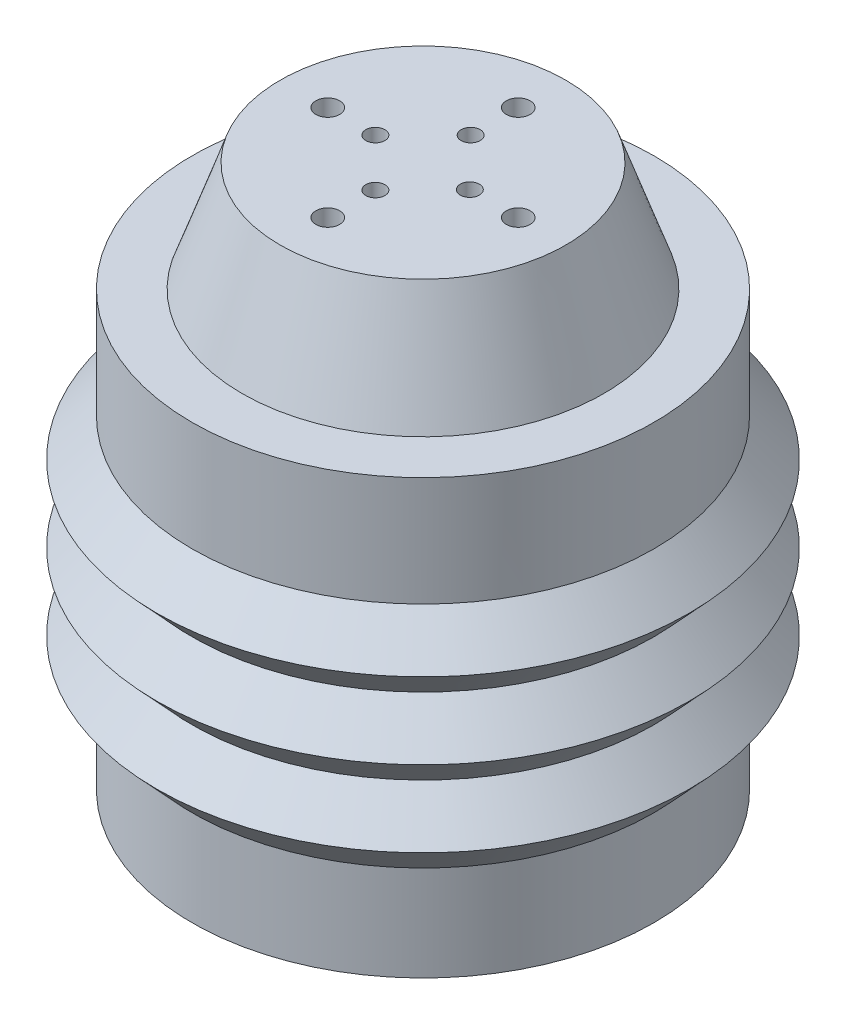
ISO-10303-21;
HEADER;
FILE_DESCRIPTION(('STEP AP214'),'2;1');
FILE_NAME('part.step','',(''),(''),'','','');
FILE_SCHEMA(('AUTOMOTIVE_DESIGN { 1 0 10303 214 1 1 1 1 }'));
ENDSEC;
DATA;
#1=APPLICATION_CONTEXT('core data for automotive mechanical design processes');
#2=APPLICATION_PROTOCOL_DEFINITION('international standard','automotive_design',2000,#1);
#3=PRODUCT_CONTEXT('',#1,'mechanical');
#4=PRODUCT('Part','Part','',(#3));
#5=PRODUCT_RELATED_PRODUCT_CATEGORY('part','',(#4));
#6=PRODUCT_DEFINITION_FORMATION('','',#4);
#7=PRODUCT_DEFINITION_CONTEXT('part definition',#1,'design');
#8=PRODUCT_DEFINITION('design','',#6,#7);
#9=PRODUCT_DEFINITION_SHAPE('','',#8);
#10=(LENGTH_UNIT() NAMED_UNIT(*) SI_UNIT(.MILLI.,.METRE.));
#11=(NAMED_UNIT(*) PLANE_ANGLE_UNIT() SI_UNIT($,.RADIAN.));
#12=(NAMED_UNIT(*) SI_UNIT($,.STERADIAN.) SOLID_ANGLE_UNIT());
#13=UNCERTAINTY_MEASURE_WITH_UNIT(LENGTH_MEASURE(1.E-05),#10,'distance_accuracy_value','');
#14=(GEOMETRIC_REPRESENTATION_CONTEXT(3) GLOBAL_UNCERTAINTY_ASSIGNED_CONTEXT((#13)) GLOBAL_UNIT_ASSIGNED_CONTEXT((#10,
#11,#12)) REPRESENTATION_CONTEXT('',''));
#15=CARTESIAN_POINT('',(0.,0.,0.));
#16=DIRECTION('',(0.,0.,1.));
#17=DIRECTION('',(1.,0.,0.));
#18=AXIS2_PLACEMENT_3D('',#15,#16,#17);
#19=CARTESIAN_POINT('',(16.960166218,20.,3.522227149));
#20=DIRECTION('',(0.,-1.,0.));
#21=DIRECTION('',(0.,0.,-1.));
#22=AXIS2_PLACEMENT_3D('',#19,#20,#21);
#23=PLANE('',#22);
#24=CARTESIAN_POINT('',(19.996166218,20.,0.486227149));
#25=DIRECTION('',(0.,-1.,0.));
#26=DIRECTION('',(1.,0.,0.));
#27=AXIS2_PLACEMENT_3D('',#24,#25,#26);
#28=CIRCLE('',#27,3.);
#29=CARTESIAN_POINT('',(22.996166218,20.,0.486227149));
#30=VERTEX_POINT('',#29);
#31=EDGE_CURVE('E19',#30,#30,#28,.F.);
#32=ORIENTED_EDGE('',*,*,#31,.F.);
#33=EDGE_LOOP('',(#32));
#34=FACE_BOUND('',#33,.T.);
#35=ADVANCED_FACE('F15',(#34),#23,.T.);
#36=CARTESIAN_POINT('',(-3.33898103,20.,23.335728997));
#37=DIRECTION('',(0.,-1.,0.));
#38=DIRECTION('',(0.,0.,-1.));
#39=AXIS2_PLACEMENT_3D('',#36,#37,#38);
#40=PLANE('',#39);
#41=CARTESIAN_POINT('',(-0.30298103,20.,20.299728997));
#42=DIRECTION('',(0.,-1.,0.));
#43=DIRECTION('',(1.,0.,0.));
#44=AXIS2_PLACEMENT_3D('',#41,#42,#43);
#45=CIRCLE('',#44,3.);
#46=CARTESIAN_POINT('',(2.69701897,20.,20.299728997));
#47=VERTEX_POINT('',#46);
#48=EDGE_CURVE('E73',#47,#47,#45,.F.);
#49=ORIENTED_EDGE('',*,*,#48,.F.);
#50=EDGE_LOOP('',(#49));
#51=FACE_BOUND('',#50,.T.);
#52=ADVANCED_FACE('F66',(#51),#40,.T.);
#53=CARTESIAN_POINT('',(14.038121048,21.952797012,14.240108401));
#54=DIRECTION('',(0.,-1.,0.));
#55=DIRECTION('',(1.,0.,0.));
#56=AXIS2_PLACEMENT_3D('',#53,#54,#55);
#57=CONICAL_SURFACE('',#56,0.,1.02974425864039);
#58=CARTESIAN_POINT('',(14.038121048,21.952797012,14.240108401));
#59=VERTEX_POINT('',#58);
#60=VERTEX_LOOP('',#59);
#61=FACE_BOUND('',#60,.T.);
#62=CARTESIAN_POINT('',(14.038121048,20.,14.240108401));
#63=DIRECTION('',(0.,-1.,0.));
#64=DIRECTION('',(0.,0.,-1.));
#65=AXIS2_PLACEMENT_3D('',#62,#63,#64);
#66=CIRCLE('',#65,3.25);
#67=CARTESIAN_POINT('',(14.038121048,20.,10.990108401));
#68=VERTEX_POINT('',#67);
#69=EDGE_CURVE('E70',#68,#68,#66,.F.);
#70=ORIENTED_EDGE('',*,*,#69,.F.);
#71=EDGE_LOOP('',(#70));
#72=FACE_BOUND('',#71,.T.);
#73=ADVANCED_FACE('F62',(#61,#72),#57,.F.);
#74=CARTESIAN_POINT('',(-14.142135624,21.952797012,14.142135624));
#75=DIRECTION('',(0.,-1.,0.));
#76=DIRECTION('',(1.,0.,0.));
#77=AXIS2_PLACEMENT_3D('',#74,#75,#76);
#78=CONICAL_SURFACE('',#77,0.,1.02974425864039);
#79=CARTESIAN_POINT('',(-14.142135624,21.952797012,14.142135624));
#80=VERTEX_POINT('',#79);
#81=VERTEX_LOOP('',#80);
#82=FACE_BOUND('',#81,.T.);
#83=CARTESIAN_POINT('',(-14.142135624,20.,14.142135624));
#84=DIRECTION('',(0.,-1.,0.));
#85=DIRECTION('',(0.,0.,-1.));
#86=AXIS2_PLACEMENT_3D('',#83,#84,#85);
#87=CIRCLE('',#86,3.25);
#88=CARTESIAN_POINT('',(-14.142135624,20.,10.892135624));
#89=VERTEX_POINT('',#88);
#90=EDGE_CURVE('E72',#89,#89,#87,.F.);
#91=ORIENTED_EDGE('',*,*,#90,.F.);
#92=EDGE_LOOP('',(#91));
#93=FACE_BOUND('',#92,.T.);
#94=ADVANCED_FACE('F65',(#82,#93),#78,.F.);
#95=CARTESIAN_POINT('',(-14.142135624,21.952797012,-14.142135624));
#96=DIRECTION('',(0.,-1.,0.));
#97=DIRECTION('',(1.,0.,0.));
#98=AXIS2_PLACEMENT_3D('',#95,#96,#97);
#99=CONICAL_SURFACE('',#98,0.,1.02974425864039);
#100=CARTESIAN_POINT('',(-14.142135624,21.952797012,-14.142135624));
#101=VERTEX_POINT('',#100);
#102=VERTEX_LOOP('',#101);
#103=FACE_BOUND('',#102,.T.);
#104=CARTESIAN_POINT('',(-14.142135624,20.,-14.142135624));
#105=DIRECTION('',(0.,-1.,0.));
#106=DIRECTION('',(0.,0.,-1.));
#107=AXIS2_PLACEMENT_3D('',#104,#105,#106);
#108=CIRCLE('',#107,3.25);
#109=CARTESIAN_POINT('',(-14.142135624,20.,-17.392135624));
#110=VERTEX_POINT('',#109);
#111=EDGE_CURVE('E76',#110,#110,#108,.F.);
#112=ORIENTED_EDGE('',*,*,#111,.F.);
#113=EDGE_LOOP('',(#112));
#114=FACE_BOUND('',#113,.T.);
#115=ADVANCED_FACE('F331',(#103,#114),#99,.F.);
#116=CARTESIAN_POINT('',(14.142135624,21.952797012,-14.142135624));
#117=DIRECTION('',(0.,-1.,0.));
#118=DIRECTION('',(1.,0.,0.));
#119=AXIS2_PLACEMENT_3D('',#116,#117,#118);
#120=CONICAL_SURFACE('',#119,0.,1.02974425864039);
#121=CARTESIAN_POINT('',(14.142135624,21.952797012,-14.142135624));
#122=VERTEX_POINT('',#121);
#123=VERTEX_LOOP('',#122);
#124=FACE_BOUND('',#123,.T.);
#125=CARTESIAN_POINT('',(14.142135624,20.,-14.142135624));
#126=DIRECTION('',(0.,-1.,0.));
#127=DIRECTION('',(0.,0.,-1.));
#128=AXIS2_PLACEMENT_3D('',#125,#126,#127);
#129=CIRCLE('',#128,3.25);
#130=CARTESIAN_POINT('',(14.142135624,20.,-17.392135624));
#131=VERTEX_POINT('',#130);
#132=EDGE_CURVE('E143',#131,#131,#129,.F.);
#133=ORIENTED_EDGE('',*,*,#132,.F.);
#134=EDGE_LOOP('',(#133));
#135=FACE_BOUND('',#134,.T.);
#136=ADVANCED_FACE('F328',(#124,#135),#120,.F.);
#137=CARTESIAN_POINT('',(-12.65,-3.,12.65));
#138=DIRECTION('',(0.,-1.,0.));
#139=DIRECTION('',(0.,0.,-1.));
#140=AXIS2_PLACEMENT_3D('',#137,#138,#139);
#141=PLANE('',#140);
#142=CARTESIAN_POINT('',(0.,-3.,0.));
#143=DIRECTION('',(0.,1.,0.));
#144=DIRECTION('',(0.,0.,1.));
#145=AXIS2_PLACEMENT_3D('',#142,#143,#144);
#146=CIRCLE('',#145,12.5);
#147=CARTESIAN_POINT('',(0.,-3.,12.5));
#148=VERTEX_POINT('',#147);
#149=EDGE_CURVE('E141',#148,#148,#146,.F.);
#150=ORIENTED_EDGE('',*,*,#149,.T.);
#151=EDGE_LOOP('',(#150));
#152=FACE_BOUND('',#151,.T.);
#153=ADVANCED_FACE('F326',(#152),#141,.T.);
#154=CARTESIAN_POINT('',(19.996166218,20.,0.486227149));
#155=DIRECTION('',(0.,-1.,0.));
#156=DIRECTION('',(1.,0.,0.));
#157=AXIS2_PLACEMENT_3D('',#154,#155,#156);
#158=CYLINDRICAL_SURFACE('',#157,3.);
#159=ORIENTED_EDGE('',*,*,#31,.T.);
#160=EDGE_LOOP('',(#159));
#161=FACE_BOUND('',#160,.T.);
#162=CARTESIAN_POINT('',(19.996166218,0.,0.486227149));
#163=DIRECTION('',(0.,-1.,0.));
#164=DIRECTION('',(1.,0.,0.));
#165=AXIS2_PLACEMENT_3D('',#162,#163,#164);
#166=CIRCLE('',#165,3.);
#167=CARTESIAN_POINT('',(22.996166218,0.,0.486227149));
#168=VERTEX_POINT('',#167);
#169=EDGE_CURVE('E138',#168,#168,#166,.T.);
#170=ORIENTED_EDGE('',*,*,#169,.T.);
#171=EDGE_LOOP('',(#170));
#172=FACE_BOUND('',#171,.T.);
#173=ADVANCED_FACE('F322',(#161,#172),#158,.F.);
#174=CARTESIAN_POINT('',(-0.30298103,20.,20.299728997));
#175=DIRECTION('',(0.,-1.,0.));
#176=DIRECTION('',(1.,0.,0.));
#177=AXIS2_PLACEMENT_3D('',#174,#175,#176);
#178=CYLINDRICAL_SURFACE('',#177,3.);
#179=ORIENTED_EDGE('',*,*,#48,.T.);
#180=EDGE_LOOP('',(#179));
#181=FACE_BOUND('',#180,.T.);
#182=CARTESIAN_POINT('',(-0.302981030000012,0.,20.299728997));
#183=DIRECTION('',(0.,-1.,0.));
#184=DIRECTION('',(1.,0.,0.));
#185=AXIS2_PLACEMENT_3D('',#182,#183,#184);
#186=CIRCLE('',#185,3.);
#187=CARTESIAN_POINT('',(2.69701896999999,0.,20.299728997));
#188=VERTEX_POINT('',#187);
#189=EDGE_CURVE('E135',#188,#188,#186,.T.);
#190=ORIENTED_EDGE('',*,*,#189,.T.);
#191=EDGE_LOOP('',(#190));
#192=FACE_BOUND('',#191,.T.);
#193=ADVANCED_FACE('F319',(#181,#192),#178,.F.);
#194=CARTESIAN_POINT('',(14.038121048,20.,14.240108401));
#195=DIRECTION('',(0.,-1.,0.));
#196=DIRECTION('',(1.,0.,0.));
#197=AXIS2_PLACEMENT_3D('',#194,#195,#196);
#198=CYLINDRICAL_SURFACE('',#197,3.25);
#199=ORIENTED_EDGE('',*,*,#69,.T.);
#200=EDGE_LOOP('',(#199));
#201=FACE_BOUND('',#200,.T.);
#202=CARTESIAN_POINT('',(14.038121048,0.,14.240108401));
#203=DIRECTION('',(0.,-1.,0.));
#204=DIRECTION('',(1.,0.,0.));
#205=AXIS2_PLACEMENT_3D('',#202,#203,#204);
#206=CIRCLE('',#205,3.25);
#207=CARTESIAN_POINT('',(17.288121048,0.,14.240108401));
#208=VERTEX_POINT('',#207);
#209=EDGE_CURVE('E132',#208,#208,#206,.T.);
#210=ORIENTED_EDGE('',*,*,#209,.T.);
#211=EDGE_LOOP('',(#210));
#212=FACE_BOUND('',#211,.T.);
#213=ADVANCED_FACE('F315',(#201,#212),#198,.F.);
#214=CARTESIAN_POINT('',(-14.142135624,20.,14.142135624));
#215=DIRECTION('',(0.,-1.,0.));
#216=DIRECTION('',(1.,0.,0.));
#217=AXIS2_PLACEMENT_3D('',#214,#215,#216);
#218=CYLINDRICAL_SURFACE('',#217,3.25);
#219=ORIENTED_EDGE('',*,*,#90,.T.);
#220=EDGE_LOOP('',(#219));
#221=FACE_BOUND('',#220,.T.);
#222=CARTESIAN_POINT('',(-14.142135624,0.,14.142135624));
#223=DIRECTION('',(0.,-1.,0.));
#224=DIRECTION('',(1.,0.,0.));
#225=AXIS2_PLACEMENT_3D('',#222,#223,#224);
#226=CIRCLE('',#225,3.25);
#227=CARTESIAN_POINT('',(-10.892135624,0.,14.142135624));
#228=VERTEX_POINT('',#227);
#229=EDGE_CURVE('E129',#228,#228,#226,.T.);
#230=ORIENTED_EDGE('',*,*,#229,.T.);
#231=EDGE_LOOP('',(#230));
#232=FACE_BOUND('',#231,.T.);
#233=ADVANCED_FACE('F311',(#221,#232),#218,.F.);
#234=CARTESIAN_POINT('',(-14.142135624,20.,-14.142135624));
#235=DIRECTION('',(0.,-1.,0.));
#236=DIRECTION('',(1.,0.,0.));
#237=AXIS2_PLACEMENT_3D('',#234,#235,#236);
#238=CYLINDRICAL_SURFACE('',#237,3.25);
#239=ORIENTED_EDGE('',*,*,#111,.T.);
#240=EDGE_LOOP('',(#239));
#241=FACE_BOUND('',#240,.T.);
#242=CARTESIAN_POINT('',(-14.142135624,0.,-14.142135624));
#243=DIRECTION('',(0.,-1.,0.));
#244=DIRECTION('',(1.,0.,0.));
#245=AXIS2_PLACEMENT_3D('',#242,#243,#244);
#246=CIRCLE('',#245,3.25);
#247=CARTESIAN_POINT('',(-10.892135624,0.,-14.142135624));
#248=VERTEX_POINT('',#247);
#249=EDGE_CURVE('E126',#248,#248,#246,.T.);
#250=ORIENTED_EDGE('',*,*,#249,.T.);
#251=EDGE_LOOP('',(#250));
#252=FACE_BOUND('',#251,.T.);
#253=ADVANCED_FACE('F308',(#241,#252),#238,.F.);
#254=CARTESIAN_POINT('',(14.142135624,20.,-14.142135624));
#255=DIRECTION('',(0.,-1.,0.));
#256=DIRECTION('',(1.,0.,0.));
#257=AXIS2_PLACEMENT_3D('',#254,#255,#256);
#258=CYLINDRICAL_SURFACE('',#257,3.25);
#259=ORIENTED_EDGE('',*,*,#132,.T.);
#260=EDGE_LOOP('',(#259));
#261=FACE_BOUND('',#260,.T.);
#262=CARTESIAN_POINT('',(14.142135624,0.,-14.142135624));
#263=DIRECTION('',(0.,-1.,0.));
#264=DIRECTION('',(1.,0.,0.));
#265=AXIS2_PLACEMENT_3D('',#262,#263,#264);
#266=CIRCLE('',#265,3.25);
#267=CARTESIAN_POINT('',(17.392135624,0.,-14.142135624));
#268=VERTEX_POINT('',#267);
#269=EDGE_CURVE('E123',#268,#268,#266,.T.);
#270=ORIENTED_EDGE('',*,*,#269,.T.);
#271=EDGE_LOOP('',(#270));
#272=FACE_BOUND('',#271,.T.);
#273=ADVANCED_FACE('F304',(#261,#272),#258,.F.);
#274=CARTESIAN_POINT('',(0.,-3.,0.));
#275=DIRECTION('',(0.,1.,0.));
#276=DIRECTION('',(0.,0.,1.));
#277=AXIS2_PLACEMENT_3D('',#274,#275,#276);
#278=CYLINDRICAL_SURFACE('',#277,12.5);
#279=ORIENTED_EDGE('',*,*,#149,.F.);
#280=EDGE_LOOP('',(#279));
#281=FACE_BOUND('',#280,.T.);
#282=CARTESIAN_POINT('',(0.,0.,0.));
#283=DIRECTION('',(0.,1.,0.));
#284=DIRECTION('',(0.,0.,1.));
#285=AXIS2_PLACEMENT_3D('',#282,#283,#284);
#286=CIRCLE('',#285,12.5);
#287=CARTESIAN_POINT('',(0.,0.,12.5));
#288=VERTEX_POINT('',#287);
#289=EDGE_CURVE('E120',#288,#288,#286,.F.);
#290=ORIENTED_EDGE('',*,*,#289,.T.);
#291=EDGE_LOOP('',(#290));
#292=FACE_BOUND('',#291,.T.);
#293=ADVANCED_FACE('F301',(#281,#292),#278,.T.);
#294=CARTESIAN_POINT('',(-49.082,0.,-49.082));
#295=DIRECTION('',(0.,1.,0.));
#296=DIRECTION('',(0.,0.,1.));
#297=AXIS2_PLACEMENT_3D('',#294,#295,#296);
#298=PLANE('',#297);
#299=ORIENTED_EDGE('',*,*,#289,.F.);
#300=EDGE_LOOP('',(#299));
#301=FACE_BOUND('',#300,.T.);
#302=ORIENTED_EDGE('',*,*,#269,.F.);
#303=EDGE_LOOP('',(#302));
#304=FACE_BOUND('',#303,.T.);
#305=ORIENTED_EDGE('',*,*,#249,.F.);
#306=EDGE_LOOP('',(#305));
#307=FACE_BOUND('',#306,.T.);
#308=ORIENTED_EDGE('',*,*,#229,.F.);
#309=EDGE_LOOP('',(#308));
#310=FACE_BOUND('',#309,.T.);
#311=ORIENTED_EDGE('',*,*,#209,.F.);
#312=EDGE_LOOP('',(#311));
#313=FACE_BOUND('',#312,.T.);
#314=ORIENTED_EDGE('',*,*,#189,.F.);
#315=EDGE_LOOP('',(#314));
#316=FACE_BOUND('',#315,.T.);
#317=ORIENTED_EDGE('',*,*,#169,.F.);
#318=EDGE_LOOP('',(#317));
#319=FACE_BOUND('',#318,.T.);
#320=CARTESIAN_POINT('',(0.,0.,0.));
#321=DIRECTION('',(0.,-1.,0.));
#322=DIRECTION('',(1.,0.,0.));
#323=AXIS2_PLACEMENT_3D('',#320,#321,#322);
#324=CIRCLE('',#323,48.5);
#325=CARTESIAN_POINT('',(48.5,0.,0.));
#326=VERTEX_POINT('',#325);
#327=EDGE_CURVE('E116',#326,#326,#324,.T.);
#328=ORIENTED_EDGE('',*,*,#327,.T.);
#329=EDGE_LOOP('',(#328));
#330=FACE_BOUND('',#329,.T.);
#331=ADVANCED_FACE('F299',(#301,#304,#307,#310,#313,#316,#319,#330),#298,.F.);
#332=CARTESIAN_POINT('',(0.,20.,0.));
#333=DIRECTION('',(0.,-1.,0.));
#334=DIRECTION('',(1.,0.,0.));
#335=AXIS2_PLACEMENT_3D('',#332,#333,#334);
#336=CYLINDRICAL_SURFACE('',#335,48.5);
#337=ORIENTED_EDGE('',*,*,#327,.F.);
#338=EDGE_LOOP('',(#337));
#339=FACE_BOUND('',#338,.T.);
#340=CARTESIAN_POINT('',(0.,20.,0.));
#341=DIRECTION('',(0.,1.,0.));
#342=DIRECTION('',(-1.,0.,0.));
#343=AXIS2_PLACEMENT_3D('',#340,#341,#342);
#344=CIRCLE('',#343,48.5);
#345=CARTESIAN_POINT('',(-48.5,20.,0.));
#346=VERTEX_POINT('',#345);
#347=EDGE_CURVE('E119',#346,#346,#344,.F.);
#348=ORIENTED_EDGE('',*,*,#347,.T.);
#349=EDGE_LOOP('',(#348));
#350=FACE_BOUND('',#349,.T.);
#351=ADVANCED_FACE('F295',(#339,#350),#336,.T.);
#352=CARTESIAN_POINT('',(0.,20.,0.));
#353=DIRECTION('',(0.,1.,0.));
#354=DIRECTION('',(0.,0.,1.));
#355=AXIS2_PLACEMENT_3D('',#352,#353,#354);
#356=CONICAL_SURFACE('',#355,48.5,0.746456820300409);
#357=ORIENTED_EDGE('',*,*,#347,.F.);
#358=EDGE_LOOP('',(#357));
#359=FACE_BOUND('',#358,.T.);
#360=CARTESIAN_POINT('',(0.,28.,0.));
#361=DIRECTION('',(0.,-1.,0.));
#362=DIRECTION('',(1.,0.,0.));
#363=AXIS2_PLACEMENT_3D('',#360,#361,#362);
#364=CIRCLE('',#363,55.9);
#365=CARTESIAN_POINT('',(55.9,28.,0.));
#366=VERTEX_POINT('',#365);
#367=EDGE_CURVE('E154',#366,#366,#364,.T.);
#368=ORIENTED_EDGE('',*,*,#367,.T.);
#369=EDGE_LOOP('',(#368));
#370=FACE_BOUND('',#369,.T.);
#371=ADVANCED_FACE('F291',(#359,#370),#356,.T.);
#372=CARTESIAN_POINT('',(0.,36.,0.));
#373=DIRECTION('',(0.,-1.,0.));
#374=DIRECTION('',(0.,0.,-1.));
#375=AXIS2_PLACEMENT_3D('',#372,#373,#374);
#376=CONICAL_SURFACE('',#375,48.5,0.746456820300409);
#377=CARTESIAN_POINT('',(0.,36.,0.));
#378=DIRECTION('',(0.,1.,0.));
#379=DIRECTION('',(-1.,0.,0.));
#380=AXIS2_PLACEMENT_3D('',#377,#378,#379);
#381=CIRCLE('',#380,48.5);
#382=CARTESIAN_POINT('',(-48.5,36.,0.));
#383=VERTEX_POINT('',#382);
#384=EDGE_CURVE('E157',#383,#383,#381,.F.);
#385=ORIENTED_EDGE('',*,*,#384,.T.);
#386=EDGE_LOOP('',(#385));
#387=FACE_BOUND('',#386,.T.);
#388=ORIENTED_EDGE('',*,*,#367,.F.);
#389=EDGE_LOOP('',(#388));
#390=FACE_BOUND('',#389,.T.);
#391=ADVANCED_FACE('F287',(#387,#390),#376,.T.);
#392=CARTESIAN_POINT('',(0.,36.,0.));
#393=DIRECTION('',(0.,1.,0.));
#394=DIRECTION('',(0.,0.,1.));
#395=AXIS2_PLACEMENT_3D('',#392,#393,#394);
#396=CONICAL_SURFACE('',#395,48.5,0.746456820300409);
#397=ORIENTED_EDGE('',*,*,#384,.F.);
#398=EDGE_LOOP('',(#397));
#399=FACE_BOUND('',#398,.T.);
#400=CARTESIAN_POINT('',(0.,44.,0.));
#401=DIRECTION('',(0.,-1.,0.));
#402=DIRECTION('',(1.,0.,0.));
#403=AXIS2_PLACEMENT_3D('',#400,#401,#402);
#404=CIRCLE('',#403,55.9);
#405=CARTESIAN_POINT('',(55.9,44.,0.));
#406=VERTEX_POINT('',#405);
#407=EDGE_CURVE('E160',#406,#406,#404,.T.);
#408=ORIENTED_EDGE('',*,*,#407,.T.);
#409=EDGE_LOOP('',(#408));
#410=FACE_BOUND('',#409,.T.);
#411=ADVANCED_FACE('F283',(#399,#410),#396,.T.);
#412=CARTESIAN_POINT('',(0.,52.,0.));
#413=DIRECTION('',(0.,-1.,0.));
#414=DIRECTION('',(0.,0.,-1.));
#415=AXIS2_PLACEMENT_3D('',#412,#413,#414);
#416=CONICAL_SURFACE('',#415,48.5,0.746456820300408);
#417=CARTESIAN_POINT('',(0.,52.,0.));
#418=DIRECTION('',(0.,1.,0.));
#419=DIRECTION('',(-1.,0.,0.));
#420=AXIS2_PLACEMENT_3D('',#417,#418,#419);
#421=CIRCLE('',#420,48.5);
#422=CARTESIAN_POINT('',(-48.5,52.,0.));
#423=VERTEX_POINT('',#422);
#424=EDGE_CURVE('E163',#423,#423,#421,.F.);
#425=ORIENTED_EDGE('',*,*,#424,.T.);
#426=EDGE_LOOP('',(#425));
#427=FACE_BOUND('',#426,.T.);
#428=ORIENTED_EDGE('',*,*,#407,.F.);
#429=EDGE_LOOP('',(#428));
#430=FACE_BOUND('',#429,.T.);
#431=ADVANCED_FACE('F279',(#427,#430),#416,.T.);
#432=CARTESIAN_POINT('',(0.,52.,0.));
#433=DIRECTION('',(0.,1.,0.));
#434=DIRECTION('',(0.,0.,1.));
#435=AXIS2_PLACEMENT_3D('',#432,#433,#434);
#436=CONICAL_SURFACE('',#435,48.5,0.746456820300409);
#437=ORIENTED_EDGE('',*,*,#424,.F.);
#438=EDGE_LOOP('',(#437));
#439=FACE_BOUND('',#438,.T.);
#440=CARTESIAN_POINT('',(0.,60.0000000000001,0.));
#441=DIRECTION('',(0.,-1.,0.));
#442=DIRECTION('',(1.,0.,0.));
#443=AXIS2_PLACEMENT_3D('',#440,#441,#442);
#444=CIRCLE('',#443,55.9);
#445=CARTESIAN_POINT('',(55.9,60.,0.));
#446=VERTEX_POINT('',#445);
#447=EDGE_CURVE('E166',#446,#446,#444,.T.);
#448=ORIENTED_EDGE('',*,*,#447,.T.);
#449=EDGE_LOOP('',(#448));
#450=FACE_BOUND('',#449,.T.);
#451=ADVANCED_FACE('F275',(#439,#450),#436,.T.);
#452=CARTESIAN_POINT('',(0.,68.,0.));
#453=DIRECTION('',(0.,-1.,0.));
#454=DIRECTION('',(0.,0.,-1.));
#455=AXIS2_PLACEMENT_3D('',#452,#453,#454);
#456=CONICAL_SURFACE('',#455,48.5,0.746456820300408);
#457=CARTESIAN_POINT('',(0.,68.,0.));
#458=DIRECTION('',(0.,1.,0.));
#459=DIRECTION('',(-1.,0.,0.));
#460=AXIS2_PLACEMENT_3D('',#457,#458,#459);
#461=CIRCLE('',#460,48.5);
#462=CARTESIAN_POINT('',(-48.5,68.,0.));
#463=VERTEX_POINT('',#462);
#464=EDGE_CURVE('E115',#463,#463,#461,.F.);
#465=ORIENTED_EDGE('',*,*,#464,.T.);
#466=EDGE_LOOP('',(#465));
#467=FACE_BOUND('',#466,.T.);
#468=ORIENTED_EDGE('',*,*,#447,.F.);
#469=EDGE_LOOP('',(#468));
#470=FACE_BOUND('',#469,.T.);
#471=ADVANCED_FACE('F271',(#467,#470),#456,.T.);
#472=CARTESIAN_POINT('',(0.,68.,0.));
#473=DIRECTION('',(0.,1.,0.));
#474=DIRECTION('',(0.,0.,1.));
#475=AXIS2_PLACEMENT_3D('',#472,#473,#474);
#476=CYLINDRICAL_SURFACE('',#475,48.5);
#477=ORIENTED_EDGE('',*,*,#464,.F.);
#478=EDGE_LOOP('',(#477));
#479=FACE_BOUND('',#478,.T.);
#480=CARTESIAN_POINT('',(0.,91.,0.));
#481=DIRECTION('',(0.,1.,0.));
#482=DIRECTION('',(0.,0.,1.));
#483=AXIS2_PLACEMENT_3D('',#480,#481,#482);
#484=CIRCLE('',#483,48.5);
#485=CARTESIAN_POINT('',(0.,91.,48.5));
#486=VERTEX_POINT('',#485);
#487=EDGE_CURVE('E112',#486,#486,#484,.T.);
#488=ORIENTED_EDGE('',*,*,#487,.F.);
#489=EDGE_LOOP('',(#488));
#490=FACE_BOUND('',#489,.T.);
#491=ADVANCED_FACE('F265',(#479,#490),#476,.T.);
#492=CARTESIAN_POINT('',(49.082,91.,-49.082));
#493=DIRECTION('',(0.,1.,0.));
#494=DIRECTION('',(-1.,0.,0.));
#495=AXIS2_PLACEMENT_3D('',#492,#493,#494);
#496=PLANE('',#495);
#497=CARTESIAN_POINT('',(0.,91.,0.));
#498=DIRECTION('',(0.,-1.,0.));
#499=DIRECTION('',(0.,0.,-1.));
#500=AXIS2_PLACEMENT_3D('',#497,#498,#499);
#501=CIRCLE('',#500,38.);
#502=CARTESIAN_POINT('',(0.,91.,-38.));
#503=VERTEX_POINT('',#502);
#504=EDGE_CURVE('E108',#503,#503,#501,.T.);
#505=ORIENTED_EDGE('',*,*,#504,.T.);
#506=EDGE_LOOP('',(#505));
#507=FACE_BOUND('',#506,.T.);
#508=ORIENTED_EDGE('',*,*,#487,.T.);
#509=EDGE_LOOP('',(#508));
#510=FACE_BOUND('',#509,.T.);
#511=ADVANCED_FACE('F255',(#507,#510),#496,.T.);
#512=CARTESIAN_POINT('',(-10.,92.798278762,0.));
#513=DIRECTION('',(0.,1.,0.));
#514=DIRECTION('',(0.,0.,1.));
#515=AXIS2_PLACEMENT_3D('',#512,#513,#514);
#516=CONICAL_SURFACE('',#515,0.,1.02974425869691);
#517=CARTESIAN_POINT('',(-10.,92.798278762,0.));
#518=VERTEX_POINT('',#517);
#519=VERTEX_LOOP('',#518);
#520=FACE_BOUND('',#519,.T.);
#521=CARTESIAN_POINT('',(-10.,94.,0.));
#522=DIRECTION('',(0.,1.,0.));
#523=DIRECTION('',(0.,0.,1.));
#524=AXIS2_PLACEMENT_3D('',#521,#522,#523);
#525=CIRCLE('',#524,2.);
#526=CARTESIAN_POINT('',(-10.,94.,2.));
#527=VERTEX_POINT('',#526);
#528=EDGE_CURVE('E111',#527,#527,#525,.F.);
#529=ORIENTED_EDGE('',*,*,#528,.F.);
#530=EDGE_LOOP('',(#529));
#531=FACE_BOUND('',#530,.T.);
#532=ADVANCED_FACE('F252',(#520,#531),#516,.F.);
#533=CARTESIAN_POINT('',(0.,92.798278762,-10.));
#534=DIRECTION('',(0.,1.,0.));
#535=DIRECTION('',(0.,0.,1.));
#536=AXIS2_PLACEMENT_3D('',#533,#534,#535);
#537=CONICAL_SURFACE('',#536,0.,1.02974425869691);
#538=CARTESIAN_POINT('',(0.,92.798278762,-10.));
#539=VERTEX_POINT('',#538);
#540=VERTEX_LOOP('',#539);
#541=FACE_BOUND('',#540,.T.);
#542=CARTESIAN_POINT('',(0.,94.,-10.));
#543=DIRECTION('',(0.,1.,0.));
#544=DIRECTION('',(0.,0.,1.));
#545=AXIS2_PLACEMENT_3D('',#542,#543,#544);
#546=CIRCLE('',#545,2.);
#547=CARTESIAN_POINT('',(0.,94.,-8.));
#548=VERTEX_POINT('',#547);
#549=EDGE_CURVE('E173',#548,#548,#546,.F.);
#550=ORIENTED_EDGE('',*,*,#549,.F.);
#551=EDGE_LOOP('',(#550));
#552=FACE_BOUND('',#551,.T.);
#553=ADVANCED_FACE('F254',(#541,#552),#537,.F.);
#554=CARTESIAN_POINT('',(0.,92.798278762,10.));
#555=DIRECTION('',(0.,1.,0.));
#556=DIRECTION('',(0.,0.,1.));
#557=AXIS2_PLACEMENT_3D('',#554,#555,#556);
#558=CONICAL_SURFACE('',#557,0.,1.02974425869691);
#559=CARTESIAN_POINT('',(0.,92.798278762,10.));
#560=VERTEX_POINT('',#559);
#561=VERTEX_LOOP('',#560);
#562=FACE_BOUND('',#561,.T.);
#563=CARTESIAN_POINT('',(0.,94.,10.));
#564=DIRECTION('',(0.,1.,0.));
#565=DIRECTION('',(0.,0.,1.));
#566=AXIS2_PLACEMENT_3D('',#563,#564,#565);
#567=CIRCLE('',#566,2.);
#568=CARTESIAN_POINT('',(0.,94.,12.));
#569=VERTEX_POINT('',#568);
#570=EDGE_CURVE('E176',#569,#569,#567,.F.);
#571=ORIENTED_EDGE('',*,*,#570,.F.);
#572=EDGE_LOOP('',(#571));
#573=FACE_BOUND('',#572,.T.);
#574=ADVANCED_FACE('F262',(#562,#573),#558,.F.);
#575=CARTESIAN_POINT('',(0.,97.497848452,-20.));
#576=DIRECTION('',(0.,1.,0.));
#577=DIRECTION('',(0.,0.,1.));
#578=AXIS2_PLACEMENT_3D('',#575,#576,#577);
#579=CONICAL_SURFACE('',#578,0.,1.02974425854996);
#580=CARTESIAN_POINT('',(0.,97.497848452,-20.));
#581=VERTEX_POINT('',#580);
#582=VERTEX_LOOP('',#581);
#583=FACE_BOUND('',#582,.T.);
#584=CARTESIAN_POINT('',(0.,99.,-20.));
#585=DIRECTION('',(0.,1.,0.));
#586=DIRECTION('',(0.,0.,1.));
#587=AXIS2_PLACEMENT_3D('',#584,#585,#586);
#588=CIRCLE('',#587,2.5);
#589=CARTESIAN_POINT('',(0.,99.,-17.5));
#590=VERTEX_POINT('',#589);
#591=EDGE_CURVE('E179',#590,#590,#588,.F.);
#592=ORIENTED_EDGE('',*,*,#591,.F.);
#593=EDGE_LOOP('',(#592));
#594=FACE_BOUND('',#593,.T.);
#595=ADVANCED_FACE('F439',(#583,#594),#579,.F.);
#596=CARTESIAN_POINT('',(-20.,97.497848452,0.));
#597=DIRECTION('',(0.,1.,0.));
#598=DIRECTION('',(0.,0.,1.));
#599=AXIS2_PLACEMENT_3D('',#596,#597,#598);
#600=CONICAL_SURFACE('',#599,0.,1.02974425854996);
#601=CARTESIAN_POINT('',(-20.,97.497848452,0.));
#602=VERTEX_POINT('',#601);
#603=VERTEX_LOOP('',#602);
#604=FACE_BOUND('',#603,.T.);
#605=CARTESIAN_POINT('',(-20.,99.,0.));
#606=DIRECTION('',(0.,1.,0.));
#607=DIRECTION('',(0.,0.,1.));
#608=AXIS2_PLACEMENT_3D('',#605,#606,#607);
#609=CIRCLE('',#608,2.5);
#610=CARTESIAN_POINT('',(-20.,99.,2.5));
#611=VERTEX_POINT('',#610);
#612=EDGE_CURVE('E182',#611,#611,#609,.F.);
#613=ORIENTED_EDGE('',*,*,#612,.F.);
#614=EDGE_LOOP('',(#613));
#615=FACE_BOUND('',#614,.T.);
#616=ADVANCED_FACE('F207',(#604,#615),#600,.F.);
#617=CARTESIAN_POINT('',(0.,97.497848452,20.));
#618=DIRECTION('',(0.,1.,0.));
#619=DIRECTION('',(0.,0.,1.));
#620=AXIS2_PLACEMENT_3D('',#617,#618,#619);
#621=CONICAL_SURFACE('',#620,0.,1.02974425854996);
#622=CARTESIAN_POINT('',(0.,97.497848452,20.));
#623=VERTEX_POINT('',#622);
#624=VERTEX_LOOP('',#623);
#625=FACE_BOUND('',#624,.T.);
#626=CARTESIAN_POINT('',(0.,99.,20.));
#627=DIRECTION('',(0.,1.,0.));
#628=DIRECTION('',(0.,0.,1.));
#629=AXIS2_PLACEMENT_3D('',#626,#627,#628);
#630=CIRCLE('',#629,2.5);
#631=CARTESIAN_POINT('',(0.,99.,22.5));
#632=VERTEX_POINT('',#631);
#633=EDGE_CURVE('E185',#632,#632,#630,.F.);
#634=ORIENTED_EDGE('',*,*,#633,.F.);
#635=EDGE_LOOP('',(#634));
#636=FACE_BOUND('',#635,.T.);
#637=ADVANCED_FACE('F196',(#625,#636),#621,.F.);
#638=CARTESIAN_POINT('',(20.,97.497848452,0.));
#639=DIRECTION('',(0.,1.,0.));
#640=DIRECTION('',(0.,0.,1.));
#641=AXIS2_PLACEMENT_3D('',#638,#639,#640);
#642=CONICAL_SURFACE('',#641,0.,1.02974425854996);
#643=CARTESIAN_POINT('',(20.,97.497848452,0.));
#644=VERTEX_POINT('',#643);
#645=VERTEX_LOOP('',#644);
#646=FACE_BOUND('',#645,.T.);
#647=CARTESIAN_POINT('',(20.,99.,0.));
#648=DIRECTION('',(0.,1.,0.));
#649=DIRECTION('',(0.,0.,1.));
#650=AXIS2_PLACEMENT_3D('',#647,#648,#649);
#651=CIRCLE('',#650,2.5);
#652=CARTESIAN_POINT('',(20.,99.,2.5));
#653=VERTEX_POINT('',#652);
#654=EDGE_CURVE('E107',#653,#653,#651,.F.);
#655=ORIENTED_EDGE('',*,*,#654,.F.);
#656=EDGE_LOOP('',(#655));
#657=FACE_BOUND('',#656,.T.);
#658=ADVANCED_FACE('F193',(#646,#657),#642,.F.);
#659=CARTESIAN_POINT('',(0.,114.,0.));
#660=DIRECTION('',(0.,-1.,0.));
#661=DIRECTION('',(0.,0.,-1.));
#662=AXIS2_PLACEMENT_3D('',#659,#660,#661);
#663=CONICAL_SURFACE('',#662,30.,0.334736837316815);
#664=ORIENTED_EDGE('',*,*,#504,.F.);
#665=EDGE_LOOP('',(#664));
#666=FACE_BOUND('',#665,.T.);
#667=CARTESIAN_POINT('',(0.,114.,0.));
#668=DIRECTION('',(0.,-1.,0.));
#669=DIRECTION('',(0.,0.,-1.));
#670=AXIS2_PLACEMENT_3D('',#667,#668,#669);
#671=CIRCLE('',#670,30.);
#672=CARTESIAN_POINT('',(0.,114.,-30.));
#673=VERTEX_POINT('',#672);
#674=EDGE_CURVE('E104',#673,#673,#671,.F.);
#675=ORIENTED_EDGE('',*,*,#674,.F.);
#676=EDGE_LOOP('',(#675));
#677=FACE_BOUND('',#676,.T.);
#678=ADVANCED_FACE('F195',(#666,#677),#663,.T.);
#679=CARTESIAN_POINT('',(-10.,94.,0.));
#680=DIRECTION('',(0.,1.,0.));
#681=DIRECTION('',(0.,0.,1.));
#682=AXIS2_PLACEMENT_3D('',#679,#680,#681);
#683=CYLINDRICAL_SURFACE('',#682,2.);
#684=CARTESIAN_POINT('',(-10.,114.,0.));
#685=DIRECTION('',(0.,1.,0.));
#686=DIRECTION('',(0.,0.,1.));
#687=AXIS2_PLACEMENT_3D('',#684,#685,#686);
#688=CIRCLE('',#687,2.);
#689=CARTESIAN_POINT('',(-10.,114.,2.));
#690=VERTEX_POINT('',#689);
#691=EDGE_CURVE('E101',#690,#690,#688,.F.);
#692=ORIENTED_EDGE('',*,*,#691,.F.);
#693=EDGE_LOOP('',(#692));
#694=FACE_BOUND('',#693,.T.);
#695=ORIENTED_EDGE('',*,*,#528,.T.);
#696=EDGE_LOOP('',(#695));
#697=FACE_BOUND('',#696,.T.);
#698=ADVANCED_FACE('F204',(#694,#697),#683,.F.);
#699=CARTESIAN_POINT('',(0.,94.,-10.));
#700=DIRECTION('',(0.,1.,0.));
#701=DIRECTION('',(0.,0.,1.));
#702=AXIS2_PLACEMENT_3D('',#699,#700,#701);
#703=CYLINDRICAL_SURFACE('',#702,2.);
#704=CARTESIAN_POINT('',(0.,114.,-10.));
#705=DIRECTION('',(0.,1.,0.));
#706=DIRECTION('',(0.,0.,1.));
#707=AXIS2_PLACEMENT_3D('',#704,#705,#706);
#708=CIRCLE('',#707,2.);
#709=CARTESIAN_POINT('',(0.,114.,-8.));
#710=VERTEX_POINT('',#709);
#711=EDGE_CURVE('E98',#710,#710,#708,.F.);
#712=ORIENTED_EDGE('',*,*,#711,.F.);
#713=EDGE_LOOP('',(#712));
#714=FACE_BOUND('',#713,.T.);
#715=ORIENTED_EDGE('',*,*,#549,.T.);
#716=EDGE_LOOP('',(#715));
#717=FACE_BOUND('',#716,.T.);
#718=ADVANCED_FACE('F239',(#714,#717),#703,.F.);
#719=CARTESIAN_POINT('',(0.,94.,10.));
#720=DIRECTION('',(0.,1.,0.));
#721=DIRECTION('',(0.,0.,1.));
#722=AXIS2_PLACEMENT_3D('',#719,#720,#721);
#723=CYLINDRICAL_SURFACE('',#722,2.);
#724=CARTESIAN_POINT('',(0.,114.,10.));
#725=DIRECTION('',(0.,1.,0.));
#726=DIRECTION('',(0.,0.,1.));
#727=AXIS2_PLACEMENT_3D('',#724,#725,#726);
#728=CIRCLE('',#727,2.);
#729=CARTESIAN_POINT('',(0.,114.,12.));
#730=VERTEX_POINT('',#729);
#731=EDGE_CURVE('E95',#730,#730,#728,.F.);
#732=ORIENTED_EDGE('',*,*,#731,.F.);
#733=EDGE_LOOP('',(#732));
#734=FACE_BOUND('',#733,.T.);
#735=ORIENTED_EDGE('',*,*,#570,.T.);
#736=EDGE_LOOP('',(#735));
#737=FACE_BOUND('',#736,.T.);
#738=ADVANCED_FACE('F235',(#734,#737),#723,.F.);
#739=CARTESIAN_POINT('',(0.,99.,-20.));
#740=DIRECTION('',(0.,1.,0.));
#741=DIRECTION('',(0.,0.,1.));
#742=AXIS2_PLACEMENT_3D('',#739,#740,#741);
#743=CYLINDRICAL_SURFACE('',#742,2.5);
#744=CARTESIAN_POINT('',(0.,114.,-20.));
#745=DIRECTION('',(0.,1.,0.));
#746=DIRECTION('',(0.,0.,1.));
#747=AXIS2_PLACEMENT_3D('',#744,#745,#746);
#748=CIRCLE('',#747,2.5);
#749=CARTESIAN_POINT('',(0.,114.,-17.5));
#750=VERTEX_POINT('',#749);
#751=EDGE_CURVE('E92',#750,#750,#748,.F.);
#752=ORIENTED_EDGE('',*,*,#751,.F.);
#753=EDGE_LOOP('',(#752));
#754=FACE_BOUND('',#753,.T.);
#755=ORIENTED_EDGE('',*,*,#591,.T.);
#756=EDGE_LOOP('',(#755));
#757=FACE_BOUND('',#756,.T.);
#758=ADVANCED_FACE('F231',(#754,#757),#743,.F.);
#759=CARTESIAN_POINT('',(-20.,99.,0.));
#760=DIRECTION('',(0.,1.,0.));
#761=DIRECTION('',(0.,0.,1.));
#762=AXIS2_PLACEMENT_3D('',#759,#760,#761);
#763=CYLINDRICAL_SURFACE('',#762,2.5);
#764=CARTESIAN_POINT('',(-20.,114.,0.));
#765=DIRECTION('',(0.,1.,0.));
#766=DIRECTION('',(0.,0.,1.));
#767=AXIS2_PLACEMENT_3D('',#764,#765,#766);
#768=CIRCLE('',#767,2.5);
#769=CARTESIAN_POINT('',(-20.,114.,2.5));
#770=VERTEX_POINT('',#769);
#771=EDGE_CURVE('E89',#770,#770,#768,.F.);
#772=ORIENTED_EDGE('',*,*,#771,.F.);
#773=EDGE_LOOP('',(#772));
#774=FACE_BOUND('',#773,.T.);
#775=ORIENTED_EDGE('',*,*,#612,.T.);
#776=EDGE_LOOP('',(#775));
#777=FACE_BOUND('',#776,.T.);
#778=ADVANCED_FACE('F227',(#774,#777),#763,.F.);
#779=CARTESIAN_POINT('',(0.,99.,20.));
#780=DIRECTION('',(0.,1.,0.));
#781=DIRECTION('',(0.,0.,1.));
#782=AXIS2_PLACEMENT_3D('',#779,#780,#781);
#783=CYLINDRICAL_SURFACE('',#782,2.5);
#784=CARTESIAN_POINT('',(0.,114.,20.));
#785=DIRECTION('',(0.,1.,0.));
#786=DIRECTION('',(0.,0.,1.));
#787=AXIS2_PLACEMENT_3D('',#784,#785,#786);
#788=CIRCLE('',#787,2.5);
#789=CARTESIAN_POINT('',(0.,114.,22.5));
#790=VERTEX_POINT('',#789);
#791=EDGE_CURVE('E86',#790,#790,#788,.F.);
#792=ORIENTED_EDGE('',*,*,#791,.F.);
#793=EDGE_LOOP('',(#792));
#794=FACE_BOUND('',#793,.T.);
#795=ORIENTED_EDGE('',*,*,#633,.T.);
#796=EDGE_LOOP('',(#795));
#797=FACE_BOUND('',#796,.T.);
#798=ADVANCED_FACE('F223',(#794,#797),#783,.F.);
#799=CARTESIAN_POINT('',(20.,99.,0.));
#800=DIRECTION('',(0.,1.,0.));
#801=DIRECTION('',(0.,0.,1.));
#802=AXIS2_PLACEMENT_3D('',#799,#800,#801);
#803=CYLINDRICAL_SURFACE('',#802,2.5);
#804=CARTESIAN_POINT('',(20.,114.,0.));
#805=DIRECTION('',(0.,1.,0.));
#806=DIRECTION('',(0.,0.,1.));
#807=AXIS2_PLACEMENT_3D('',#804,#805,#806);
#808=CIRCLE('',#807,2.5);
#809=CARTESIAN_POINT('',(20.,114.,2.5));
#810=VERTEX_POINT('',#809);
#811=EDGE_CURVE('E83',#810,#810,#808,.F.);
#812=ORIENTED_EDGE('',*,*,#811,.F.);
#813=EDGE_LOOP('',(#812));
#814=FACE_BOUND('',#813,.T.);
#815=ORIENTED_EDGE('',*,*,#654,.T.);
#816=EDGE_LOOP('',(#815));
#817=FACE_BOUND('',#816,.T.);
#818=ADVANCED_FACE('F191',(#814,#817),#803,.F.);
#819=CARTESIAN_POINT('',(30.36,114.,-30.36));
#820=DIRECTION('',(0.,1.,0.));
#821=DIRECTION('',(-1.,0.,0.));
#822=AXIS2_PLACEMENT_3D('',#819,#820,#821);
#823=PLANE('',#822);
#824=ORIENTED_EDGE('',*,*,#811,.T.);
#825=EDGE_LOOP('',(#824));
#826=FACE_BOUND('',#825,.T.);
#827=ORIENTED_EDGE('',*,*,#791,.T.);
#828=EDGE_LOOP('',(#827));
#829=FACE_BOUND('',#828,.T.);
#830=ORIENTED_EDGE('',*,*,#771,.T.);
#831=EDGE_LOOP('',(#830));
#832=FACE_BOUND('',#831,.T.);
#833=ORIENTED_EDGE('',*,*,#751,.T.);
#834=EDGE_LOOP('',(#833));
#835=FACE_BOUND('',#834,.T.);
#836=ORIENTED_EDGE('',*,*,#731,.T.);
#837=EDGE_LOOP('',(#836));
#838=FACE_BOUND('',#837,.T.);
#839=ORIENTED_EDGE('',*,*,#711,.T.);
#840=EDGE_LOOP('',(#839));
#841=FACE_BOUND('',#840,.T.);
#842=ORIENTED_EDGE('',*,*,#691,.T.);
#843=EDGE_LOOP('',(#842));
#844=FACE_BOUND('',#843,.T.);
#845=CARTESIAN_POINT('',(9.833865708,114.,0.));
#846=DIRECTION('',(0.,1.,0.));
#847=DIRECTION('',(0.,0.,1.));
#848=AXIS2_PLACEMENT_3D('',#845,#846,#847);
#849=CIRCLE('',#848,2.);
#850=CARTESIAN_POINT('',(9.833865708,114.,2.));
#851=VERTEX_POINT('',#850);
#852=EDGE_CURVE('E25',#851,#851,#849,.T.);
#853=ORIENTED_EDGE('',*,*,#852,.F.);
#854=EDGE_LOOP('',(#853));
#855=FACE_BOUND('',#854,.T.);
#856=ORIENTED_EDGE('',*,*,#674,.T.);
#857=EDGE_LOOP('',(#856));
#858=FACE_BOUND('',#857,.T.);
#859=ADVANCED_FACE('F17',(#826,#829,#832,#835,#838,#841,#844,#855,#858),#823,.T.);
#860=CARTESIAN_POINT('',(9.833865708,94.,0.));
#861=DIRECTION('',(0.,1.,0.));
#862=DIRECTION('',(0.,0.,1.));
#863=AXIS2_PLACEMENT_3D('',#860,#861,#862);
#864=CYLINDRICAL_SURFACE('',#863,2.);
#865=ORIENTED_EDGE('',*,*,#852,.T.);
#866=EDGE_LOOP('',(#865));
#867=FACE_BOUND('',#866,.T.);
#868=CARTESIAN_POINT('',(9.833865708,94.,0.));
#869=DIRECTION('',(0.,1.,0.));
#870=DIRECTION('',(0.,0.,1.));
#871=AXIS2_PLACEMENT_3D('',#868,#869,#870);
#872=CIRCLE('',#871,2.);
#873=CARTESIAN_POINT('',(9.833865708,94.,2.));
#874=VERTEX_POINT('',#873);
#875=EDGE_CURVE('E10',#874,#874,#872,.T.);
#876=ORIENTED_EDGE('',*,*,#875,.F.);
#877=EDGE_LOOP('',(#876));
#878=FACE_BOUND('',#877,.T.);
#879=ADVANCED_FACE('F212',(#867,#878),#864,.F.);
#880=CARTESIAN_POINT('',(9.833865708,92.798278762,0.));
#881=DIRECTION('',(0.,1.,0.));
#882=DIRECTION('',(0.,0.,1.));
#883=AXIS2_PLACEMENT_3D('',#880,#881,#882);
#884=CONICAL_SURFACE('',#883,0.,1.02974425869691);
#885=CARTESIAN_POINT('',(9.833865708,92.798278762,0.));
#886=VERTEX_POINT('',#885);
#887=VERTEX_LOOP('',#886);
#888=FACE_BOUND('',#887,.T.);
#889=ORIENTED_EDGE('',*,*,#875,.T.);
#890=EDGE_LOOP('',(#889));
#891=FACE_BOUND('',#890,.T.);
#892=ADVANCED_FACE('F210',(#888,#891),#884,.F.);
#893=CLOSED_SHELL('',(#35,#52,#73,#94,#115,#136,#153,#173,#193,#213,#233,#253,#273,#293,#331,
#351,#371,#391,#411,#431,#451,#471,#491,#511,#532,#553,#574,#595,#616,#637,#658,#678,#698,#718,
#738,#758,#778,#798,#818,#859,#879,#892));
#894=MANIFOLD_SOLID_BREP('B1',#893);
#895=ADVANCED_BREP_SHAPE_REPRESENTATION('',(#18,#894),#14);
#896=SHAPE_DEFINITION_REPRESENTATION(#9,#895);
ENDSEC;
END-ISO-10303-21;
